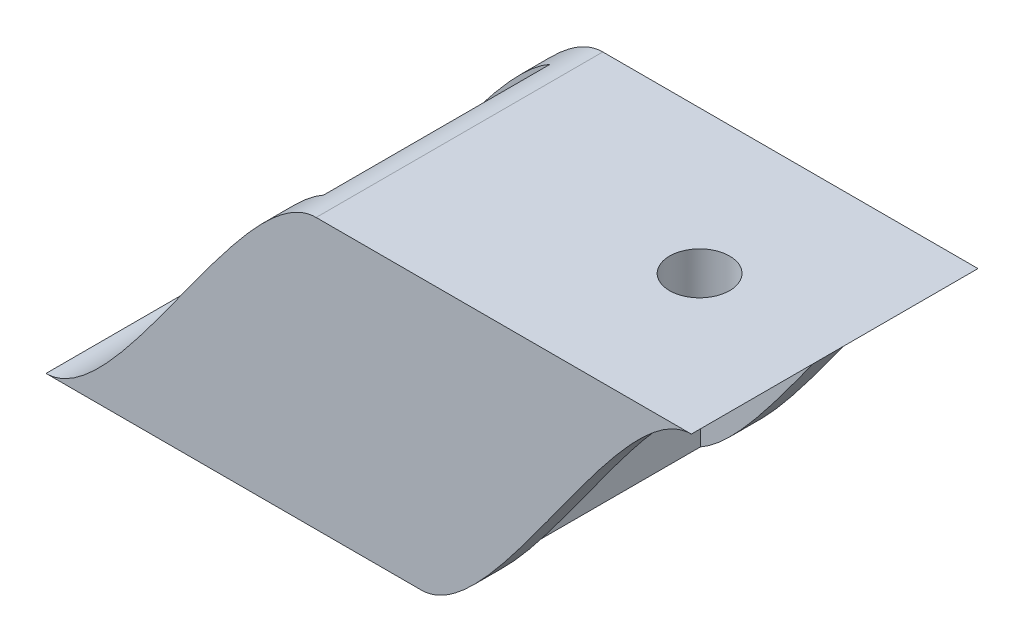
ISO-10303-21;
HEADER;
FILE_DESCRIPTION(('STEP AP214'),'2;1');
FILE_NAME('part.step','',(''),(''),'','','');
FILE_SCHEMA(('AUTOMOTIVE_DESIGN { 1 0 10303 214 1 1 1 1 }'));
ENDSEC;
DATA;
#1=APPLICATION_CONTEXT('core data for automotive mechanical design processes');
#2=APPLICATION_PROTOCOL_DEFINITION('international standard','automotive_design',2000,#1);
#3=PRODUCT_CONTEXT('',#1,'mechanical');
#4=PRODUCT('Part','Part','',(#3));
#5=PRODUCT_RELATED_PRODUCT_CATEGORY('part','',(#4));
#6=PRODUCT_DEFINITION_FORMATION('','',#4);
#7=PRODUCT_DEFINITION_CONTEXT('part definition',#1,'design');
#8=PRODUCT_DEFINITION('design','',#6,#7);
#9=PRODUCT_DEFINITION_SHAPE('','',#8);
#10=(LENGTH_UNIT() NAMED_UNIT(*) SI_UNIT(.MILLI.,.METRE.));
#11=(NAMED_UNIT(*) PLANE_ANGLE_UNIT() SI_UNIT($,.RADIAN.));
#12=(NAMED_UNIT(*) SI_UNIT($,.STERADIAN.) SOLID_ANGLE_UNIT());
#13=UNCERTAINTY_MEASURE_WITH_UNIT(LENGTH_MEASURE(1.E-05),#10,'distance_accuracy_value','');
#14=(GEOMETRIC_REPRESENTATION_CONTEXT(3) GLOBAL_UNCERTAINTY_ASSIGNED_CONTEXT((#13)) GLOBAL_UNIT_ASSIGNED_CONTEXT((#10,
#11,#12)) REPRESENTATION_CONTEXT('',''));
#15=CARTESIAN_POINT('',(0.,0.,0.));
#16=DIRECTION('',(0.,0.,1.));
#17=DIRECTION('',(1.,0.,0.));
#18=AXIS2_PLACEMENT_3D('',#15,#16,#17);
#19=CARTESIAN_POINT('',(50.0000000000004,0.,38.2));
#20=CARTESIAN_POINT('',(60.0000000000004,0.,38.2));
#21=CARTESIAN_POINT('',(76.,36.,38.2));
#22=CARTESIAN_POINT('',(86.,36.,38.2));
#23=B_SPLINE_CURVE_WITH_KNOTS('',3,(#19,#20,#21,#22),.UNSPECIFIED.,.F.,.F.,(4,4),(0.,1.),.UNSPECIFIED.);
#24=DIRECTION('',(0.,0.,-1.));
#25=VECTOR('',#24,1.);
#26=SURFACE_OF_LINEAR_EXTRUSION('',#23,#25);
#27=CARTESIAN_POINT('',(50.0000000000004,0.,0.));
#28=CARTESIAN_POINT('',(60.0000000000004,0.,0.));
#29=CARTESIAN_POINT('',(76.,36.,0.));
#30=CARTESIAN_POINT('',(86.,36.,0.));
#31=B_SPLINE_CURVE_WITH_KNOTS('',3,(#27,#28,#29,#30),.UNSPECIFIED.,.F.,.F.,(4,4),(0.,1.),.UNSPECIFIED.);
#32=CARTESIAN_POINT('',(50.0000000000004,0.,0.));
#33=VERTEX_POINT('',#32);
#34=CARTESIAN_POINT('',(86.,36.,0.));
#35=VERTEX_POINT('',#34);
#36=EDGE_CURVE('E239',#33,#35,#31,.T.);
#37=ORIENTED_EDGE('',*,*,#36,.T.);
#38=DIRECTION('',(0.,0.,-1.));
#39=VECTOR('',#38,1.);
#40=CARTESIAN_POINT('',(86.,36.,38.2));
#41=LINE('',#40,#39);
#42=CARTESIAN_POINT('',(86.,36.,38.2));
#43=VERTEX_POINT('',#42);
#44=EDGE_CURVE('E266',#43,#35,#41,.T.);
#45=ORIENTED_EDGE('',*,*,#44,.F.);
#46=CARTESIAN_POINT('',(50.0000000000004,0.,38.2));
#47=VERTEX_POINT('',#46);
#48=EDGE_CURVE('E231',#47,#43,#23,.T.);
#49=ORIENTED_EDGE('',*,*,#48,.F.);
#50=DIRECTION('',(0.,0.,-1.));
#51=VECTOR('',#50,1.);
#52=CARTESIAN_POINT('',(50.0000000000004,0.,38.2));
#53=LINE('',#52,#51);
#54=EDGE_CURVE('E200',#47,#33,#53,.T.);
#55=ORIENTED_EDGE('',*,*,#54,.T.);
#56=EDGE_LOOP('',(#37,#45,#49,#55));
#57=FACE_BOUND('',#56,.T.);
#58=CARTESIAN_POINT('',(50.0000000000004,0.,34.2));
#59=CARTESIAN_POINT('',(60.0000000000004,0.,34.2));
#60=CARTESIAN_POINT('',(76.,36.,34.2));
#61=CARTESIAN_POINT('',(86.,36.,34.2));
#62=B_SPLINE_CURVE_WITH_KNOTS('',3,(#58,#59,#60,#61),.UNSPECIFIED.,.F.,.F.,(4,4),(0.,1.),.UNSPECIFIED.);
#63=CARTESIAN_POINT('',(77.2255295576706,30.,34.2));
#64=VERTEX_POINT('',#63);
#65=CARTESIAN_POINT('',(53.,0.91175645929323,34.2));
#66=VERTEX_POINT('',#65);
#67=EDGE_CURVE('E11',#64,#66,#62,.F.);
#68=ORIENTED_EDGE('',*,*,#67,.F.);
#69=DIRECTION('',(0.,0.,-1.));
#70=VECTOR('',#69,1.);
#71=CARTESIAN_POINT('',(77.2255295576706,30.,38.2));
#72=LINE('',#71,#70);
#73=CARTESIAN_POINT('',(77.2255295576706,30.,4.));
#74=VERTEX_POINT('',#73);
#75=EDGE_CURVE('E157',#74,#64,#72,.F.);
#76=ORIENTED_EDGE('',*,*,#75,.F.);
#77=CARTESIAN_POINT('',(50.0000000000004,0.,4.));
#78=CARTESIAN_POINT('',(60.0000000000004,0.,4.));
#79=CARTESIAN_POINT('',(76.,36.,4.));
#80=CARTESIAN_POINT('',(86.,36.,4.));
#81=B_SPLINE_CURVE_WITH_KNOTS('',3,(#77,#78,#79,#80),.UNSPECIFIED.,.F.,.F.,(4,4),(0.,1.),.UNSPECIFIED.);
#82=CARTESIAN_POINT('',(53.,0.911756457835353,4.));
#83=VERTEX_POINT('',#82);
#84=EDGE_CURVE('E293',#74,#83,#81,.F.);
#85=ORIENTED_EDGE('',*,*,#84,.T.);
#86=DIRECTION('',(0.,0.,-1.));
#87=VECTOR('',#86,1.);
#88=CARTESIAN_POINT('',(53.,0.91175645929323,38.2));
#89=LINE('',#88,#87);
#90=EDGE_CURVE('E53',#83,#66,#89,.F.);
#91=ORIENTED_EDGE('',*,*,#90,.T.);
#92=EDGE_LOOP('',(#68,#76,#85,#91));
#93=FACE_BOUND('',#92,.T.);
#94=ADVANCED_FACE('F42',(#57,#93),#26,.F.);
#95=CARTESIAN_POINT('',(68.0000000000002,36.,19.1));
#96=DIRECTION('',(0.,-1.,0.));
#97=DIRECTION('',(0.,0.,-1.));
#98=AXIS2_PLACEMENT_3D('',#95,#96,#97);
#99=CYLINDRICAL_SURFACE('',#98,4.00000000000001);
#100=CARTESIAN_POINT('',(68.0000000000002,36.,19.1));
#101=DIRECTION('',(0.,1.,0.));
#102=DIRECTION('',(0.,0.,1.));
#103=AXIS2_PLACEMENT_3D('',#100,#101,#102);
#104=CIRCLE('',#103,4.00000000000001);
#105=CARTESIAN_POINT('',(68.0000000000002,36.,23.1));
#106=VERTEX_POINT('',#105);
#107=EDGE_CURVE('E192',#106,#106,#104,.T.);
#108=ORIENTED_EDGE('',*,*,#107,.T.);
#109=EDGE_LOOP('',(#108));
#110=FACE_BOUND('',#109,.T.);
#111=CARTESIAN_POINT('',(68.0000000000002,30.,19.1));
#112=DIRECTION('',(0.,-1.,0.));
#113=DIRECTION('',(0.,0.,-1.));
#114=AXIS2_PLACEMENT_3D('',#111,#112,#113);
#115=CIRCLE('',#114,4.00000000000001);
#116=CARTESIAN_POINT('',(68.0000000000002,30.,15.1));
#117=VERTEX_POINT('',#116);
#118=EDGE_CURVE('E151',#117,#117,#115,.T.);
#119=ORIENTED_EDGE('',*,*,#118,.T.);
#120=EDGE_LOOP('',(#119));
#121=FACE_BOUND('',#120,.T.);
#122=ADVANCED_FACE('F222',(#110,#121),#99,.F.);
#123=CARTESIAN_POINT('',(36.0000000000001,36.,38.2));
#124=CARTESIAN_POINT('',(26.0000000000001,36.,38.2));
#125=CARTESIAN_POINT('',(10.,0.,38.2));
#126=CARTESIAN_POINT('',(0.,0.,38.2));
#127=B_SPLINE_CURVE_WITH_KNOTS('',3,(#123,#124,#125,#126),.UNSPECIFIED.,.F.,.F.,(4,4),(0.,1.),.UNSPECIFIED.);
#128=DIRECTION('',(0.,0.,-1.));
#129=VECTOR('',#128,1.);
#130=SURFACE_OF_LINEAR_EXTRUSION('',#127,#129);
#131=CARTESIAN_POINT('',(36.0000000000001,36.,0.));
#132=CARTESIAN_POINT('',(26.0000000000001,36.,0.));
#133=CARTESIAN_POINT('',(10.,0.,0.));
#134=CARTESIAN_POINT('',(0.,0.,0.));
#135=B_SPLINE_CURVE_WITH_KNOTS('',3,(#131,#132,#133,#134),.UNSPECIFIED.,.F.,.F.,(4,4),(0.,1.),.UNSPECIFIED.);
#136=CARTESIAN_POINT('',(36.0000000000001,36.,0.));
#137=VERTEX_POINT('',#136);
#138=CARTESIAN_POINT('',(0.,0.,0.));
#139=VERTEX_POINT('',#138);
#140=EDGE_CURVE('E209',#137,#139,#135,.T.);
#141=ORIENTED_EDGE('',*,*,#140,.T.);
#142=DIRECTION('',(0.,0.,-1.));
#143=VECTOR('',#142,1.);
#144=CARTESIAN_POINT('',(0.,0.,38.2));
#145=LINE('',#144,#143);
#146=CARTESIAN_POINT('',(0.,0.,38.2));
#147=VERTEX_POINT('',#146);
#148=EDGE_CURVE('E255',#147,#139,#145,.T.);
#149=ORIENTED_EDGE('',*,*,#148,.F.);
#150=CARTESIAN_POINT('',(36.0000000000001,36.,38.2));
#151=VERTEX_POINT('',#150);
#152=EDGE_CURVE('E201',#151,#147,#127,.T.);
#153=ORIENTED_EDGE('',*,*,#152,.F.);
#154=DIRECTION('',(0.,0.,-1.));
#155=VECTOR('',#154,1.);
#156=CARTESIAN_POINT('',(36.0000000000001,36.,38.2));
#157=LINE('',#156,#155);
#158=EDGE_CURVE('E208',#151,#137,#157,.T.);
#159=ORIENTED_EDGE('',*,*,#158,.T.);
#160=EDGE_LOOP('',(#141,#149,#153,#159));
#161=FACE_BOUND('',#160,.T.);
#162=DIRECTION('',(0.,0.,-1.));
#163=VECTOR('',#162,1.);
#164=CARTESIAN_POINT('',(33.0000000000001,35.0882435407065,38.2));
#165=LINE('',#164,#163);
#166=CARTESIAN_POINT('',(33.0000000000001,35.0882435421644,34.2));
#167=VERTEX_POINT('',#166);
#168=CARTESIAN_POINT('',(33.0000000000001,35.0882435421644,4.));
#169=VERTEX_POINT('',#168);
#170=EDGE_CURVE('E287',#167,#169,#165,.T.);
#171=ORIENTED_EDGE('',*,*,#170,.F.);
#172=CARTESIAN_POINT('',(36.0000000000001,36.,34.2));
#173=CARTESIAN_POINT('',(26.0000000000001,36.,34.2));
#174=CARTESIAN_POINT('',(10.,0.,34.2));
#175=CARTESIAN_POINT('',(0.,0.,34.2));
#176=B_SPLINE_CURVE_WITH_KNOTS('',3,(#172,#173,#174,#175),.UNSPECIFIED.,.F.,.F.,(4,4),(0.,1.),.UNSPECIFIED.);
#177=CARTESIAN_POINT('',(6.68179790701827,3.80000000000001,34.2));
#178=VERTEX_POINT('',#177);
#179=EDGE_CURVE('E278',#167,#178,#176,.T.);
#180=ORIENTED_EDGE('',*,*,#179,.T.);
#181=DIRECTION('',(0.,0.,-1.));
#182=VECTOR('',#181,1.);
#183=CARTESIAN_POINT('',(6.68179790701827,3.79999999999986,38.2));
#184=LINE('',#183,#182);
#185=CARTESIAN_POINT('',(6.68179790701827,3.79999999999986,4.));
#186=VERTEX_POINT('',#185);
#187=EDGE_CURVE('E189',#186,#178,#184,.F.);
#188=ORIENTED_EDGE('',*,*,#187,.F.);
#189=CARTESIAN_POINT('',(36.0000000000001,36.,4.));
#190=CARTESIAN_POINT('',(26.0000000000001,36.,4.));
#191=CARTESIAN_POINT('',(10.,0.,4.));
#192=CARTESIAN_POINT('',(0.,0.,4.));
#193=B_SPLINE_CURVE_WITH_KNOTS('',3,(#189,#190,#191,#192),.UNSPECIFIED.,.F.,.F.,(4,4),(0.,1.),.UNSPECIFIED.);
#194=EDGE_CURVE('E270',#169,#186,#193,.T.);
#195=ORIENTED_EDGE('',*,*,#194,.F.);
#196=EDGE_LOOP('',(#171,#180,#188,#195));
#197=FACE_BOUND('',#196,.T.);
#198=ADVANCED_FACE('F217',(#161,#197),#130,.F.);
#199=CARTESIAN_POINT('',(18.0000000000001,36.,19.1));
#200=DIRECTION('',(0.,-1.,0.));
#201=DIRECTION('',(0.,0.,-1.));
#202=AXIS2_PLACEMENT_3D('',#199,#200,#201);
#203=CYLINDRICAL_SURFACE('',#202,4.);
#204=CARTESIAN_POINT('',(18.0000000000001,0.,19.1));
#205=DIRECTION('',(0.,1.,0.));
#206=DIRECTION('',(0.,0.,1.));
#207=AXIS2_PLACEMENT_3D('',#204,#205,#206);
#208=CIRCLE('',#207,4.);
#209=CARTESIAN_POINT('',(18.0000000000001,0.,23.1));
#210=VERTEX_POINT('',#209);
#211=EDGE_CURVE('E196',#210,#210,#208,.T.);
#212=ORIENTED_EDGE('',*,*,#211,.F.);
#213=EDGE_LOOP('',(#212));
#214=FACE_BOUND('',#213,.T.);
#215=CARTESIAN_POINT('',(18.0000000000001,3.8,19.1));
#216=DIRECTION('',(0.,1.,0.));
#217=DIRECTION('',(-1.,0.,0.));
#218=AXIS2_PLACEMENT_3D('',#215,#216,#217);
#219=CIRCLE('',#218,4.);
#220=CARTESIAN_POINT('',(14.0000000000001,3.8,19.1));
#221=VERTEX_POINT('',#220);
#222=EDGE_CURVE('E185',#221,#221,#219,.T.);
#223=ORIENTED_EDGE('',*,*,#222,.T.);
#224=EDGE_LOOP('',(#223));
#225=FACE_BOUND('',#224,.T.);
#226=ADVANCED_FACE('F221',(#214,#225),#203,.F.);
#227=CARTESIAN_POINT('',(0.,0.,38.2));
#228=DIRECTION('',(0.,1.,0.));
#229=DIRECTION('',(0.,0.,1.));
#230=AXIS2_PLACEMENT_3D('',#227,#228,#229);
#231=PLANE('',#230);
#232=ORIENTED_EDGE('',*,*,#211,.T.);
#233=EDGE_LOOP('',(#232));
#234=FACE_BOUND('',#233,.T.);
#235=ORIENTED_EDGE('',*,*,#54,.F.);
#236=DIRECTION('',(1.,0.,0.));
#237=VECTOR('',#236,1.);
#238=CARTESIAN_POINT('',(0.,0.,38.2));
#239=LINE('',#238,#237);
#240=EDGE_CURVE('E243',#147,#47,#239,.T.);
#241=ORIENTED_EDGE('',*,*,#240,.F.);
#242=ORIENTED_EDGE('',*,*,#148,.T.);
#243=DIRECTION('',(1.,0.,0.));
#244=VECTOR('',#243,1.);
#245=CARTESIAN_POINT('',(0.,0.,0.));
#246=LINE('',#245,#244);
#247=EDGE_CURVE('E256',#139,#33,#246,.T.);
#248=ORIENTED_EDGE('',*,*,#247,.T.);
#249=EDGE_LOOP('',(#235,#241,#242,#248));
#250=FACE_BOUND('',#249,.T.);
#251=ADVANCED_FACE('F44',(#234,#250),#231,.F.);
#252=CARTESIAN_POINT('',(0.,36.,38.2));
#253=DIRECTION('',(0.,1.,0.));
#254=DIRECTION('',(-1.,0.,0.));
#255=AXIS2_PLACEMENT_3D('',#252,#253,#254);
#256=PLANE('',#255);
#257=ORIENTED_EDGE('',*,*,#107,.F.);
#258=EDGE_LOOP('',(#257));
#259=FACE_BOUND('',#258,.T.);
#260=ORIENTED_EDGE('',*,*,#158,.F.);
#261=DIRECTION('',(1.,0.,0.));
#262=VECTOR('',#261,1.);
#263=CARTESIAN_POINT('',(0.,36.,38.2));
#264=LINE('',#263,#262);
#265=EDGE_CURVE('E250',#151,#43,#264,.T.);
#266=ORIENTED_EDGE('',*,*,#265,.T.);
#267=ORIENTED_EDGE('',*,*,#44,.T.);
#268=DIRECTION('',(1.,0.,0.));
#269=VECTOR('',#268,1.);
#270=CARTESIAN_POINT('',(0.,36.,0.));
#271=LINE('',#270,#269);
#272=EDGE_CURVE('E251',#137,#35,#271,.T.);
#273=ORIENTED_EDGE('',*,*,#272,.F.);
#274=EDGE_LOOP('',(#260,#266,#267,#273));
#275=FACE_BOUND('',#274,.T.);
#276=ADVANCED_FACE('F345',(#259,#275),#256,.T.);
#277=CARTESIAN_POINT('',(0.,0.,38.2));
#278=DIRECTION('',(0.,0.,1.));
#279=DIRECTION('',(1.,0.,0.));
#280=AXIS2_PLACEMENT_3D('',#277,#278,#279);
#281=PLANE('',#280);
#282=ORIENTED_EDGE('',*,*,#152,.T.);
#283=ORIENTED_EDGE('',*,*,#240,.T.);
#284=ORIENTED_EDGE('',*,*,#48,.T.);
#285=ORIENTED_EDGE('',*,*,#265,.F.);
#286=EDGE_LOOP('',(#282,#283,#284,#285));
#287=FACE_BOUND('',#286,.T.);
#288=ADVANCED_FACE('F229',(#287),#281,.T.);
#289=CARTESIAN_POINT('',(0.,0.,0.));
#290=DIRECTION('',(0.,0.,1.));
#291=DIRECTION('',(1.,0.,0.));
#292=AXIS2_PLACEMENT_3D('',#289,#290,#291);
#293=PLANE('',#292);
#294=ORIENTED_EDGE('',*,*,#247,.F.);
#295=ORIENTED_EDGE('',*,*,#140,.F.);
#296=ORIENTED_EDGE('',*,*,#272,.T.);
#297=ORIENTED_EDGE('',*,*,#36,.F.);
#298=EDGE_LOOP('',(#294,#295,#296,#297));
#299=FACE_BOUND('',#298,.T.);
#300=ADVANCED_FACE('F335',(#299),#293,.F.);
#301=CARTESIAN_POINT('',(33.0000000000001,3.8,0.));
#302=DIRECTION('',(-1.,0.,0.));
#303=DIRECTION('',(0.,0.,1.));
#304=AXIS2_PLACEMENT_3D('',#301,#302,#303);
#305=PLANE('',#304);
#306=ORIENTED_EDGE('',*,*,#170,.T.);
#307=DIRECTION('',(0.,1.,0.));
#308=VECTOR('',#307,1.);
#309=CARTESIAN_POINT('',(33.0000000000001,3.8,4.));
#310=LINE('',#309,#308);
#311=CARTESIAN_POINT('',(33.0000000000001,3.8,4.));
#312=VERTEX_POINT('',#311);
#313=EDGE_CURVE('E181',#312,#169,#310,.T.);
#314=ORIENTED_EDGE('',*,*,#313,.F.);
#315=DIRECTION('',(0.,0.,1.));
#316=VECTOR('',#315,1.);
#317=CARTESIAN_POINT('',(33.0000000000001,3.8,0.));
#318=LINE('',#317,#316);
#319=CARTESIAN_POINT('',(33.0000000000001,3.8,34.2));
#320=VERTEX_POINT('',#319);
#321=EDGE_CURVE('E172',#312,#320,#318,.T.);
#322=ORIENTED_EDGE('',*,*,#321,.T.);
#323=DIRECTION('',(0.,1.,0.));
#324=VECTOR('',#323,1.);
#325=CARTESIAN_POINT('',(33.0000000000001,3.8,34.2));
#326=LINE('',#325,#324);
#327=EDGE_CURVE('E182',#320,#167,#326,.T.);
#328=ORIENTED_EDGE('',*,*,#327,.T.);
#329=EDGE_LOOP('',(#306,#314,#322,#328));
#330=FACE_BOUND('',#329,.T.);
#331=ADVANCED_FACE('F329',(#330),#305,.T.);
#332=CARTESIAN_POINT('',(0.,3.8,34.2));
#333=DIRECTION('',(0.,0.,1.));
#334=DIRECTION('',(1.,0.,0.));
#335=AXIS2_PLACEMENT_3D('',#332,#333,#334);
#336=PLANE('',#335);
#337=ORIENTED_EDGE('',*,*,#327,.F.);
#338=DIRECTION('',(1.,0.,0.));
#339=VECTOR('',#338,1.);
#340=CARTESIAN_POINT('',(0.,3.8,34.2));
#341=LINE('',#340,#339);
#342=EDGE_CURVE('E178',#178,#320,#341,.T.);
#343=ORIENTED_EDGE('',*,*,#342,.F.);
#344=ORIENTED_EDGE('',*,*,#179,.F.);
#345=EDGE_LOOP('',(#337,#343,#344));
#346=FACE_BOUND('',#345,.T.);
#347=ADVANCED_FACE('F326',(#346),#336,.F.);
#348=CARTESIAN_POINT('',(0.,3.8,4.));
#349=DIRECTION('',(0.,0.,1.));
#350=DIRECTION('',(1.,0.,0.));
#351=AXIS2_PLACEMENT_3D('',#348,#349,#350);
#352=PLANE('',#351);
#353=ORIENTED_EDGE('',*,*,#194,.T.);
#354=DIRECTION('',(1.,0.,0.));
#355=VECTOR('',#354,1.);
#356=CARTESIAN_POINT('',(0.,3.8,4.));
#357=LINE('',#356,#355);
#358=EDGE_CURVE('E74',#186,#312,#357,.T.);
#359=ORIENTED_EDGE('',*,*,#358,.T.);
#360=ORIENTED_EDGE('',*,*,#313,.T.);
#361=EDGE_LOOP('',(#353,#359,#360));
#362=FACE_BOUND('',#361,.T.);
#363=ADVANCED_FACE('F324',(#362),#352,.T.);
#364=CARTESIAN_POINT('',(0.,3.8,0.));
#365=DIRECTION('',(0.,1.,0.));
#366=DIRECTION('',(-1.,0.,0.));
#367=AXIS2_PLACEMENT_3D('',#364,#365,#366);
#368=PLANE('',#367);
#369=ORIENTED_EDGE('',*,*,#222,.F.);
#370=EDGE_LOOP('',(#369));
#371=FACE_BOUND('',#370,.T.);
#372=ORIENTED_EDGE('',*,*,#187,.T.);
#373=ORIENTED_EDGE('',*,*,#342,.T.);
#374=ORIENTED_EDGE('',*,*,#321,.F.);
#375=ORIENTED_EDGE('',*,*,#358,.F.);
#376=EDGE_LOOP('',(#372,#373,#374,#375));
#377=FACE_BOUND('',#376,.T.);
#378=ADVANCED_FACE('F321',(#371,#377),#368,.T.);
#379=CARTESIAN_POINT('',(86.,0.,34.2));
#380=DIRECTION('',(0.,0.,-1.));
#381=DIRECTION('',(-1.,0.,0.));
#382=AXIS2_PLACEMENT_3D('',#379,#380,#381);
#383=PLANE('',#382);
#384=ORIENTED_EDGE('',*,*,#67,.T.);
#385=DIRECTION('',(0.,1.,0.));
#386=VECTOR('',#385,1.);
#387=CARTESIAN_POINT('',(53.,0.,34.2));
#388=LINE('',#387,#386);
#389=CARTESIAN_POINT('',(53.,30.,34.2));
#390=VERTEX_POINT('',#389);
#391=EDGE_CURVE('E142',#66,#390,#388,.T.);
#392=ORIENTED_EDGE('',*,*,#391,.T.);
#393=DIRECTION('',(-1.,0.,0.));
#394=VECTOR('',#393,1.);
#395=CARTESIAN_POINT('',(86.,30.,34.2));
#396=LINE('',#395,#394);
#397=EDGE_CURVE('E145',#64,#390,#396,.T.);
#398=ORIENTED_EDGE('',*,*,#397,.F.);
#399=EDGE_LOOP('',(#384,#392,#398));
#400=FACE_BOUND('',#399,.T.);
#401=ADVANCED_FACE('F144',(#400),#383,.T.);
#402=CARTESIAN_POINT('',(53.,0.,4.));
#403=DIRECTION('',(-1.,0.,0.));
#404=DIRECTION('',(0.,0.,1.));
#405=AXIS2_PLACEMENT_3D('',#402,#403,#404);
#406=PLANE('',#405);
#407=DIRECTION('',(0.,1.,0.));
#408=VECTOR('',#407,1.);
#409=CARTESIAN_POINT('',(53.,0.,4.));
#410=LINE('',#409,#408);
#411=CARTESIAN_POINT('',(53.,30.,4.));
#412=VERTEX_POINT('',#411);
#413=EDGE_CURVE('E152',#83,#412,#410,.T.);
#414=ORIENTED_EDGE('',*,*,#413,.T.);
#415=DIRECTION('',(0.,0.,1.));
#416=VECTOR('',#415,1.);
#417=CARTESIAN_POINT('',(53.,30.,4.));
#418=LINE('',#417,#416);
#419=EDGE_CURVE('E155',#412,#390,#418,.T.);
#420=ORIENTED_EDGE('',*,*,#419,.T.);
#421=ORIENTED_EDGE('',*,*,#391,.F.);
#422=ORIENTED_EDGE('',*,*,#90,.F.);
#423=EDGE_LOOP('',(#414,#420,#421,#422));
#424=FACE_BOUND('',#423,.T.);
#425=ADVANCED_FACE('F160',(#424),#406,.F.);
#426=CARTESIAN_POINT('',(86.,0.,4.));
#427=DIRECTION('',(0.,0.,-1.));
#428=DIRECTION('',(-1.,0.,0.));
#429=AXIS2_PLACEMENT_3D('',#426,#427,#428);
#430=PLANE('',#429);
#431=DIRECTION('',(-1.,0.,0.));
#432=VECTOR('',#431,1.);
#433=CARTESIAN_POINT('',(86.,30.,4.));
#434=LINE('',#433,#432);
#435=EDGE_CURVE('E63',#74,#412,#434,.T.);
#436=ORIENTED_EDGE('',*,*,#435,.T.);
#437=ORIENTED_EDGE('',*,*,#413,.F.);
#438=ORIENTED_EDGE('',*,*,#84,.F.);
#439=EDGE_LOOP('',(#436,#437,#438));
#440=FACE_BOUND('',#439,.T.);
#441=ADVANCED_FACE('F308',(#440),#430,.F.);
#442=CARTESIAN_POINT('',(0.,30.,0.));
#443=DIRECTION('',(0.,-1.,0.));
#444=DIRECTION('',(0.,0.,-1.));
#445=AXIS2_PLACEMENT_3D('',#442,#443,#444);
#446=PLANE('',#445);
#447=ORIENTED_EDGE('',*,*,#118,.F.);
#448=EDGE_LOOP('',(#447));
#449=FACE_BOUND('',#448,.T.);
#450=ORIENTED_EDGE('',*,*,#75,.T.);
#451=ORIENTED_EDGE('',*,*,#397,.T.);
#452=ORIENTED_EDGE('',*,*,#419,.F.);
#453=ORIENTED_EDGE('',*,*,#435,.F.);
#454=EDGE_LOOP('',(#450,#451,#452,#453));
#455=FACE_BOUND('',#454,.T.);
#456=ADVANCED_FACE('F154',(#449,#455),#446,.T.);
#457=CLOSED_SHELL('',(#94,#122,#198,#226,#251,#276,#288,#300,#331,#347,#363,#378,#401,#425,#441,#456));
#458=MANIFOLD_SOLID_BREP('B2',#457);
#459=ADVANCED_BREP_SHAPE_REPRESENTATION('',(#18,#458),#14);
#460=SHAPE_DEFINITION_REPRESENTATION(#9,#459);
ENDSEC;
END-ISO-10303-21;
